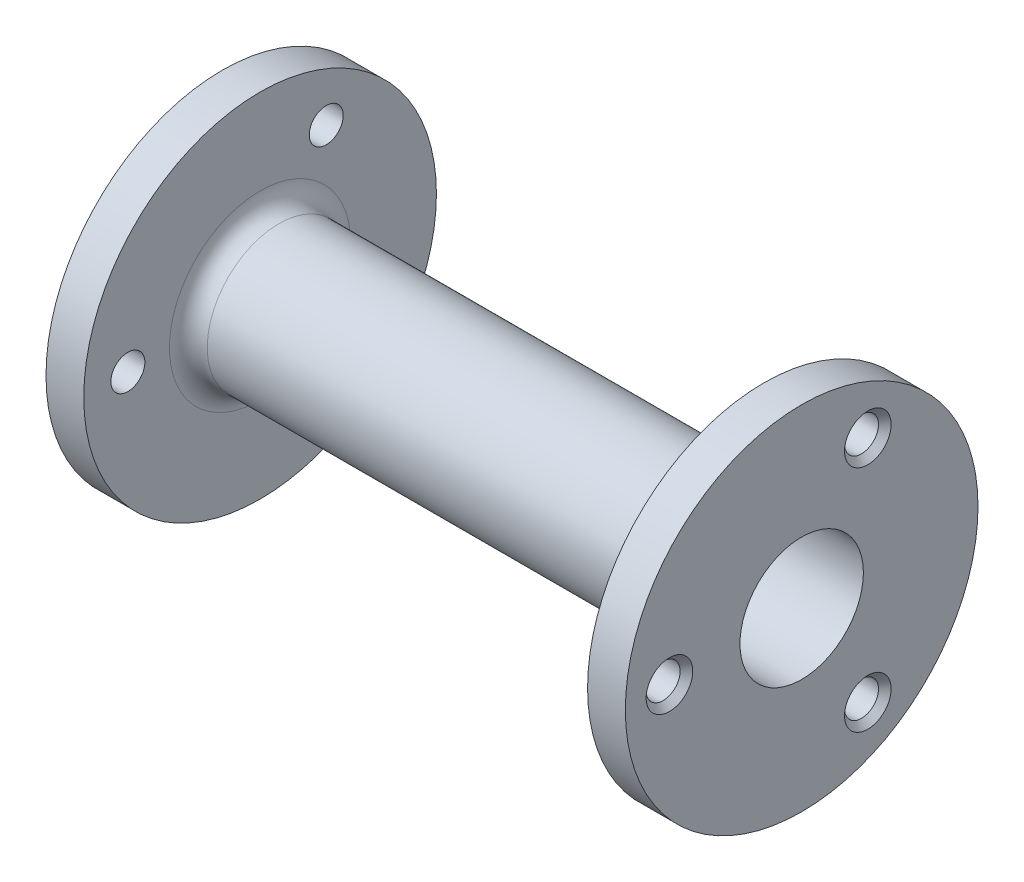
ISO-10303-21;
HEADER;
FILE_DESCRIPTION(('STEP AP214'),'2;1');
FILE_NAME('part.step','',(''),(''),'','','');
FILE_SCHEMA(('AUTOMOTIVE_DESIGN { 1 0 10303 214 1 1 1 1 }'));
ENDSEC;
DATA;
#1=APPLICATION_CONTEXT('core data for automotive mechanical design processes');
#2=APPLICATION_PROTOCOL_DEFINITION('international standard','automotive_design',2000,#1);
#3=PRODUCT_CONTEXT('',#1,'mechanical');
#4=PRODUCT('Part','Part','',(#3));
#5=PRODUCT_RELATED_PRODUCT_CATEGORY('part','',(#4));
#6=PRODUCT_DEFINITION_FORMATION('','',#4);
#7=PRODUCT_DEFINITION_CONTEXT('part definition',#1,'design');
#8=PRODUCT_DEFINITION('design','',#6,#7);
#9=PRODUCT_DEFINITION_SHAPE('','',#8);
#10=(LENGTH_UNIT() NAMED_UNIT(*) SI_UNIT(.MILLI.,.METRE.));
#11=(NAMED_UNIT(*) PLANE_ANGLE_UNIT() SI_UNIT($,.RADIAN.));
#12=(NAMED_UNIT(*) SI_UNIT($,.STERADIAN.) SOLID_ANGLE_UNIT());
#13=UNCERTAINTY_MEASURE_WITH_UNIT(LENGTH_MEASURE(1.E-05),#10,'distance_accuracy_value','');
#14=(GEOMETRIC_REPRESENTATION_CONTEXT(3) GLOBAL_UNCERTAINTY_ASSIGNED_CONTEXT((#13)) GLOBAL_UNIT_ASSIGNED_CONTEXT((#10,
#11,#12)) REPRESENTATION_CONTEXT('',''));
#15=CARTESIAN_POINT('',(0.,0.,0.));
#16=DIRECTION('',(0.,0.,1.));
#17=DIRECTION('',(1.,0.,0.));
#18=AXIS2_PLACEMENT_3D('',#15,#16,#17);
#19=CARTESIAN_POINT('',(0.,0.,0.));
#20=DIRECTION('',(1.,0.,0.));
#21=DIRECTION('',(0.,0.,-1.));
#22=AXIS2_PLACEMENT_3D('',#19,#20,#21);
#23=CYLINDRICAL_SURFACE('',#22,14.);
#24=CARTESIAN_POINT('',(0.,0.,0.));
#25=DIRECTION('',(1.,0.,0.));
#26=DIRECTION('',(0.,0.,-1.));
#27=AXIS2_PLACEMENT_3D('',#24,#25,#26);
#28=CIRCLE('',#27,14.);
#29=CARTESIAN_POINT('',(0.,0.,-14.));
#30=VERTEX_POINT('',#29);
#31=EDGE_CURVE('E104',#30,#30,#28,.T.);
#32=ORIENTED_EDGE('',*,*,#31,.T.);
#33=EDGE_LOOP('',(#32));
#34=FACE_BOUND('',#33,.T.);
#35=CARTESIAN_POINT('',(3.,0.,0.));
#36=DIRECTION('',(1.,0.,0.));
#37=DIRECTION('',(0.,0.,-1.));
#38=AXIS2_PLACEMENT_3D('',#35,#36,#37);
#39=CIRCLE('',#38,14.);
#40=CARTESIAN_POINT('',(3.,0.,-14.));
#41=VERTEX_POINT('',#40);
#42=EDGE_CURVE('E77',#41,#41,#39,.T.);
#43=ORIENTED_EDGE('',*,*,#42,.F.);
#44=EDGE_LOOP('',(#43));
#45=FACE_BOUND('',#44,.T.);
#46=ADVANCED_FACE('F33',(#34,#45),#23,.T.);
#47=CARTESIAN_POINT('',(3.,14.,0.));
#48=DIRECTION('',(1.,0.,0.));
#49=DIRECTION('',(0.,0.,-1.));
#50=AXIS2_PLACEMENT_3D('',#47,#48,#49);
#51=PLANE('',#50);
#52=CARTESIAN_POINT('',(3.,0.,10.5));
#53=DIRECTION('',(1.,0.,0.));
#54=DIRECTION('',(0.,0.,-1.));
#55=AXIS2_PLACEMENT_3D('',#52,#53,#54);
#56=CIRCLE('',#55,1.35);
#57=CARTESIAN_POINT('',(3.,0.,9.15));
#58=VERTEX_POINT('',#57);
#59=EDGE_CURVE('E107',#58,#58,#56,.T.);
#60=ORIENTED_EDGE('',*,*,#59,.F.);
#61=EDGE_LOOP('',(#60));
#62=FACE_BOUND('',#61,.T.);
#63=CARTESIAN_POINT('',(3.,9.09326673973658,-5.25000000000007));
#64=DIRECTION('',(1.,0.,0.));
#65=DIRECTION('',(0.,0.,-1.));
#66=AXIS2_PLACEMENT_3D('',#63,#64,#65);
#67=CIRCLE('',#66,1.35);
#68=CARTESIAN_POINT('',(3.,9.09326673973658,-6.60000000000007));
#69=VERTEX_POINT('',#68);
#70=EDGE_CURVE('E113',#69,#69,#67,.T.);
#71=ORIENTED_EDGE('',*,*,#70,.F.);
#72=EDGE_LOOP('',(#71));
#73=FACE_BOUND('',#72,.T.);
#74=CARTESIAN_POINT('',(3.,-9.09326673973668,-5.25000000000001));
#75=DIRECTION('',(1.,0.,0.));
#76=DIRECTION('',(0.,0.,-1.));
#77=AXIS2_PLACEMENT_3D('',#74,#75,#76);
#78=CIRCLE('',#77,1.35);
#79=CARTESIAN_POINT('',(3.,-9.09326673973668,-6.60000000000001));
#80=VERTEX_POINT('',#79);
#81=EDGE_CURVE('E119',#80,#80,#78,.T.);
#82=ORIENTED_EDGE('',*,*,#81,.F.);
#83=EDGE_LOOP('',(#82));
#84=FACE_BOUND('',#83,.T.);
#85=ORIENTED_EDGE('',*,*,#42,.T.);
#86=EDGE_LOOP('',(#85));
#87=FACE_BOUND('',#86,.T.);
#88=CARTESIAN_POINT('',(3.,0.,0.));
#89=DIRECTION('',(1.,0.,0.));
#90=DIRECTION('',(0.,0.,-1.));
#91=AXIS2_PLACEMENT_3D('',#88,#89,#90);
#92=CIRCLE('',#91,7.2);
#93=CARTESIAN_POINT('',(3.,0.,-7.2));
#94=VERTEX_POINT('',#93);
#95=EDGE_CURVE('E80',#94,#94,#92,.T.);
#96=ORIENTED_EDGE('',*,*,#95,.F.);
#97=EDGE_LOOP('',(#96));
#98=FACE_BOUND('',#97,.T.);
#99=ADVANCED_FACE('F167',(#62,#73,#84,#87,#98),#51,.T.);
#100=CARTESIAN_POINT('',(4.5,0.,0.));
#101=DIRECTION('',(1.,0.,0.));
#102=DIRECTION('',(0.,0.,-1.));
#103=AXIS2_PLACEMENT_3D('',#100,#101,#102);
#104=TOROIDAL_SURFACE('',#103,7.2,1.5);
#105=ORIENTED_EDGE('',*,*,#95,.T.);
#106=EDGE_LOOP('',(#105));
#107=FACE_BOUND('',#106,.T.);
#108=CARTESIAN_POINT('',(4.5,0.,0.));
#109=DIRECTION('',(1.,0.,0.));
#110=DIRECTION('',(0.,0.,-1.));
#111=AXIS2_PLACEMENT_3D('',#108,#109,#110);
#112=CIRCLE('',#111,5.7);
#113=CARTESIAN_POINT('',(4.5,0.,-5.7));
#114=VERTEX_POINT('',#113);
#115=EDGE_CURVE('E83',#114,#114,#112,.T.);
#116=ORIENTED_EDGE('',*,*,#115,.F.);
#117=EDGE_LOOP('',(#116));
#118=FACE_BOUND('',#117,.T.);
#119=ADVANCED_FACE('F173',(#107,#118),#104,.F.);
#120=CARTESIAN_POINT('',(0.,0.,0.));
#121=DIRECTION('',(1.,0.,0.));
#122=DIRECTION('',(0.,0.,-1.));
#123=AXIS2_PLACEMENT_3D('',#120,#121,#122);
#124=CYLINDRICAL_SURFACE('',#123,5.7);
#125=ORIENTED_EDGE('',*,*,#115,.T.);
#126=EDGE_LOOP('',(#125));
#127=FACE_BOUND('',#126,.T.);
#128=CARTESIAN_POINT('',(41.5,0.,0.));
#129=DIRECTION('',(1.,0.,0.));
#130=DIRECTION('',(0.,0.,-1.));
#131=AXIS2_PLACEMENT_3D('',#128,#129,#130);
#132=CIRCLE('',#131,5.7);
#133=CARTESIAN_POINT('',(41.5,0.,-5.7));
#134=VERTEX_POINT('',#133);
#135=EDGE_CURVE('E86',#134,#134,#132,.T.);
#136=ORIENTED_EDGE('',*,*,#135,.F.);
#137=EDGE_LOOP('',(#136));
#138=FACE_BOUND('',#137,.T.);
#139=ADVANCED_FACE('F180',(#127,#138),#124,.T.);
#140=CARTESIAN_POINT('',(41.5,0.,0.));
#141=DIRECTION('',(1.,0.,0.));
#142=DIRECTION('',(0.,0.,-1.));
#143=AXIS2_PLACEMENT_3D('',#140,#141,#142);
#144=TOROIDAL_SURFACE('',#143,7.2,1.5);
#145=ORIENTED_EDGE('',*,*,#135,.T.);
#146=EDGE_LOOP('',(#145));
#147=FACE_BOUND('',#146,.T.);
#148=CARTESIAN_POINT('',(43.,0.,0.));
#149=DIRECTION('',(1.,0.,0.));
#150=DIRECTION('',(0.,0.,-1.));
#151=AXIS2_PLACEMENT_3D('',#148,#149,#150);
#152=CIRCLE('',#151,7.2);
#153=CARTESIAN_POINT('',(43.,0.,-7.2));
#154=VERTEX_POINT('',#153);
#155=EDGE_CURVE('E89',#154,#154,#152,.T.);
#156=ORIENTED_EDGE('',*,*,#155,.F.);
#157=EDGE_LOOP('',(#156));
#158=FACE_BOUND('',#157,.T.);
#159=ADVANCED_FACE('F132',(#147,#158),#144,.F.);
#160=CARTESIAN_POINT('',(43.,7.2,0.));
#161=DIRECTION('',(-1.,0.,0.));
#162=DIRECTION('',(0.,0.,1.));
#163=AXIS2_PLACEMENT_3D('',#160,#161,#162);
#164=PLANE('',#163);
#165=CARTESIAN_POINT('',(43.,0.,10.5));
#166=DIRECTION('',(-1.,0.,0.));
#167=DIRECTION('',(0.,0.,1.));
#168=AXIS2_PLACEMENT_3D('',#165,#166,#167);
#169=CIRCLE('',#168,1.35);
#170=CARTESIAN_POINT('',(43.,0.,11.85));
#171=VERTEX_POINT('',#170);
#172=EDGE_CURVE('E110',#171,#171,#169,.T.);
#173=ORIENTED_EDGE('',*,*,#172,.F.);
#174=EDGE_LOOP('',(#173));
#175=FACE_BOUND('',#174,.T.);
#176=CARTESIAN_POINT('',(43.,9.09326673973658,-5.25000000000007));
#177=DIRECTION('',(-1.,0.,0.));
#178=DIRECTION('',(0.,0.,1.));
#179=AXIS2_PLACEMENT_3D('',#176,#177,#178);
#180=CIRCLE('',#179,1.35);
#181=CARTESIAN_POINT('',(43.,9.09326673973658,-3.90000000000007));
#182=VERTEX_POINT('',#181);
#183=EDGE_CURVE('E116',#182,#182,#180,.T.);
#184=ORIENTED_EDGE('',*,*,#183,.F.);
#185=EDGE_LOOP('',(#184));
#186=FACE_BOUND('',#185,.T.);
#187=CARTESIAN_POINT('',(43.,-9.09326673973668,-5.25000000000001));
#188=DIRECTION('',(-1.,0.,0.));
#189=DIRECTION('',(0.,0.,1.));
#190=AXIS2_PLACEMENT_3D('',#187,#188,#189);
#191=CIRCLE('',#190,1.35);
#192=CARTESIAN_POINT('',(43.,-9.09326673973668,-3.90000000000001));
#193=VERTEX_POINT('',#192);
#194=EDGE_CURVE('E122',#193,#193,#191,.T.);
#195=ORIENTED_EDGE('',*,*,#194,.F.);
#196=EDGE_LOOP('',(#195));
#197=FACE_BOUND('',#196,.T.);
#198=ORIENTED_EDGE('',*,*,#155,.T.);
#199=EDGE_LOOP('',(#198));
#200=FACE_BOUND('',#199,.T.);
#201=CARTESIAN_POINT('',(43.,0.,0.));
#202=DIRECTION('',(1.,0.,0.));
#203=DIRECTION('',(0.,0.,-1.));
#204=AXIS2_PLACEMENT_3D('',#201,#202,#203);
#205=CIRCLE('',#204,14.);
#206=CARTESIAN_POINT('',(43.,0.,-14.));
#207=VERTEX_POINT('',#206);
#208=EDGE_CURVE('E92',#207,#207,#205,.T.);
#209=ORIENTED_EDGE('',*,*,#208,.F.);
#210=EDGE_LOOP('',(#209));
#211=FACE_BOUND('',#210,.T.);
#212=ADVANCED_FACE('F128',(#175,#186,#197,#200,#211),#164,.T.);
#213=CARTESIAN_POINT('',(0.,0.,0.));
#214=DIRECTION('',(1.,0.,0.));
#215=DIRECTION('',(0.,0.,-1.));
#216=AXIS2_PLACEMENT_3D('',#213,#214,#215);
#217=CYLINDRICAL_SURFACE('',#216,14.);
#218=ORIENTED_EDGE('',*,*,#208,.T.);
#219=EDGE_LOOP('',(#218));
#220=FACE_BOUND('',#219,.T.);
#221=CARTESIAN_POINT('',(46.,0.,0.));
#222=DIRECTION('',(1.,0.,0.));
#223=DIRECTION('',(0.,0.,-1.));
#224=AXIS2_PLACEMENT_3D('',#221,#222,#223);
#225=CIRCLE('',#224,14.);
#226=CARTESIAN_POINT('',(46.,0.,-14.));
#227=VERTEX_POINT('',#226);
#228=EDGE_CURVE('E95',#227,#227,#225,.T.);
#229=ORIENTED_EDGE('',*,*,#228,.F.);
#230=EDGE_LOOP('',(#229));
#231=FACE_BOUND('',#230,.T.);
#232=ADVANCED_FACE('F131',(#220,#231),#217,.T.);
#233=CARTESIAN_POINT('',(46.,14.,0.));
#234=DIRECTION('',(1.,0.,0.));
#235=DIRECTION('',(0.,0.,-1.));
#236=AXIS2_PLACEMENT_3D('',#233,#234,#235);
#237=PLANE('',#236);
#238=CARTESIAN_POINT('',(46.,0.,10.5));
#239=DIRECTION('',(1.,0.,0.));
#240=DIRECTION('',(0.,0.,-1.));
#241=AXIS2_PLACEMENT_3D('',#238,#239,#240);
#242=CIRCLE('',#241,1.85);
#243=CARTESIAN_POINT('',(46.,0.,8.65));
#244=VERTEX_POINT('',#243);
#245=EDGE_CURVE('E44',#244,#244,#242,.F.);
#246=ORIENTED_EDGE('',*,*,#245,.T.);
#247=EDGE_LOOP('',(#246));
#248=FACE_BOUND('',#247,.T.);
#249=CARTESIAN_POINT('',(46.,-9.09326673973668,-5.25000000000001));
#250=DIRECTION('',(1.,0.,0.));
#251=DIRECTION('',(0.,0.,-1.));
#252=AXIS2_PLACEMENT_3D('',#249,#250,#251);
#253=CIRCLE('',#252,1.85);
#254=CARTESIAN_POINT('',(46.,-9.09326673973668,-7.10000000000002));
#255=VERTEX_POINT('',#254);
#256=EDGE_CURVE('E48',#255,#255,#253,.F.);
#257=ORIENTED_EDGE('',*,*,#256,.T.);
#258=EDGE_LOOP('',(#257));
#259=FACE_BOUND('',#258,.T.);
#260=CARTESIAN_POINT('',(46.,9.09326673973658,-5.25000000000007));
#261=DIRECTION('',(1.,0.,0.));
#262=DIRECTION('',(0.,0.,-1.));
#263=AXIS2_PLACEMENT_3D('',#260,#261,#262);
#264=CIRCLE('',#263,1.85);
#265=CARTESIAN_POINT('',(46.,9.09326673973658,-7.10000000000008));
#266=VERTEX_POINT('',#265);
#267=EDGE_CURVE('E53',#266,#266,#264,.F.);
#268=ORIENTED_EDGE('',*,*,#267,.T.);
#269=EDGE_LOOP('',(#268));
#270=FACE_BOUND('',#269,.T.);
#271=ORIENTED_EDGE('',*,*,#228,.T.);
#272=EDGE_LOOP('',(#271));
#273=FACE_BOUND('',#272,.T.);
#274=CARTESIAN_POINT('',(46.,0.,0.));
#275=DIRECTION('',(1.,0.,0.));
#276=DIRECTION('',(0.,0.,-1.));
#277=AXIS2_PLACEMENT_3D('',#274,#275,#276);
#278=CIRCLE('',#277,4.9);
#279=CARTESIAN_POINT('',(46.,0.,-4.9));
#280=VERTEX_POINT('',#279);
#281=EDGE_CURVE('E98',#280,#280,#278,.T.);
#282=ORIENTED_EDGE('',*,*,#281,.F.);
#283=EDGE_LOOP('',(#282));
#284=FACE_BOUND('',#283,.T.);
#285=ADVANCED_FACE('F141',(#248,#259,#270,#273,#284),#237,.T.);
#286=CARTESIAN_POINT('',(0.,0.,0.));
#287=DIRECTION('',(1.,0.,0.));
#288=DIRECTION('',(0.,0.,-1.));
#289=AXIS2_PLACEMENT_3D('',#286,#287,#288);
#290=CYLINDRICAL_SURFACE('',#289,4.9);
#291=ORIENTED_EDGE('',*,*,#281,.T.);
#292=EDGE_LOOP('',(#291));
#293=FACE_BOUND('',#292,.T.);
#294=CARTESIAN_POINT('',(0.,0.,0.));
#295=DIRECTION('',(1.,0.,0.));
#296=DIRECTION('',(0.,0.,-1.));
#297=AXIS2_PLACEMENT_3D('',#294,#295,#296);
#298=CIRCLE('',#297,4.9);
#299=CARTESIAN_POINT('',(0.,0.,-4.9));
#300=VERTEX_POINT('',#299);
#301=EDGE_CURVE('E101',#300,#300,#298,.T.);
#302=ORIENTED_EDGE('',*,*,#301,.F.);
#303=EDGE_LOOP('',(#302));
#304=FACE_BOUND('',#303,.T.);
#305=ADVANCED_FACE('F147',(#293,#304),#290,.F.);
#306=CARTESIAN_POINT('',(0.,4.9,0.));
#307=DIRECTION('',(-1.,0.,0.));
#308=DIRECTION('',(0.,0.,1.));
#309=AXIS2_PLACEMENT_3D('',#306,#307,#308);
#310=PLANE('',#309);
#311=CARTESIAN_POINT('',(0.,-9.09326673973668,-5.25000000000001));
#312=DIRECTION('',(-1.,0.,0.));
#313=DIRECTION('',(0.,0.,1.));
#314=AXIS2_PLACEMENT_3D('',#311,#312,#313);
#315=CIRCLE('',#314,1.84999999999998);
#316=CARTESIAN_POINT('',(0.,-9.09326673973668,-3.40000000000003));
#317=VERTEX_POINT('',#316);
#318=EDGE_CURVE('E68',#317,#317,#315,.F.);
#319=ORIENTED_EDGE('',*,*,#318,.T.);
#320=EDGE_LOOP('',(#319));
#321=FACE_BOUND('',#320,.T.);
#322=CARTESIAN_POINT('',(0.,9.09326673973658,-5.25000000000007));
#323=DIRECTION('',(-1.,0.,0.));
#324=DIRECTION('',(0.,0.,1.));
#325=AXIS2_PLACEMENT_3D('',#322,#323,#324);
#326=CIRCLE('',#325,1.85);
#327=CARTESIAN_POINT('',(0.,9.09326673973658,-3.40000000000007));
#328=VERTEX_POINT('',#327);
#329=EDGE_CURVE('E71',#328,#328,#326,.F.);
#330=ORIENTED_EDGE('',*,*,#329,.T.);
#331=EDGE_LOOP('',(#330));
#332=FACE_BOUND('',#331,.T.);
#333=CARTESIAN_POINT('',(0.,0.,10.5));
#334=DIRECTION('',(-1.,0.,0.));
#335=DIRECTION('',(0.,0.,1.));
#336=AXIS2_PLACEMENT_3D('',#333,#334,#335);
#337=CIRCLE('',#336,1.84999999999999);
#338=CARTESIAN_POINT('',(0.,0.,12.35));
#339=VERTEX_POINT('',#338);
#340=EDGE_CURVE('E74',#339,#339,#337,.F.);
#341=ORIENTED_EDGE('',*,*,#340,.T.);
#342=EDGE_LOOP('',(#341));
#343=FACE_BOUND('',#342,.T.);
#344=ORIENTED_EDGE('',*,*,#301,.T.);
#345=EDGE_LOOP('',(#344));
#346=FACE_BOUND('',#345,.T.);
#347=ORIENTED_EDGE('',*,*,#31,.F.);
#348=EDGE_LOOP('',(#347));
#349=FACE_BOUND('',#348,.T.);
#350=ADVANCED_FACE('F154',(#321,#332,#343,#346,#349),#310,.T.);
#351=CARTESIAN_POINT('',(0.,-9.09326673973668,-5.25000000000001));
#352=DIRECTION('',(1.,0.,0.));
#353=DIRECTION('',(0.,0.,-1.));
#354=AXIS2_PLACEMENT_3D('',#351,#352,#353);
#355=CYLINDRICAL_SURFACE('',#354,1.35);
#356=CARTESIAN_POINT('',(0.499999999999993,-9.09326673973668,-5.25000000000001));
#357=DIRECTION('',(-1.,0.,0.));
#358=DIRECTION('',(0.,0.,1.));
#359=AXIS2_PLACEMENT_3D('',#356,#357,#358);
#360=CIRCLE('',#359,1.35);
#361=CARTESIAN_POINT('',(0.499999999999993,-9.09326673973668,-3.90000000000001));
#362=VERTEX_POINT('',#361);
#363=EDGE_CURVE('E65',#362,#362,#360,.T.);
#364=ORIENTED_EDGE('',*,*,#363,.T.);
#365=EDGE_LOOP('',(#364));
#366=FACE_BOUND('',#365,.T.);
#367=ORIENTED_EDGE('',*,*,#81,.T.);
#368=EDGE_LOOP('',(#367));
#369=FACE_BOUND('',#368,.T.);
#370=ADVANCED_FACE('F160',(#366,#369),#355,.F.);
#371=CARTESIAN_POINT('',(0.,9.09326673973658,-5.25000000000007));
#372=DIRECTION('',(1.,0.,0.));
#373=DIRECTION('',(0.,0.,-1.));
#374=AXIS2_PLACEMENT_3D('',#371,#372,#373);
#375=CYLINDRICAL_SURFACE('',#374,1.35);
#376=CARTESIAN_POINT('',(0.5,9.09326673973658,-5.25000000000007));
#377=DIRECTION('',(-1.,0.,0.));
#378=DIRECTION('',(0.,0.,1.));
#379=AXIS2_PLACEMENT_3D('',#376,#377,#378);
#380=CIRCLE('',#379,1.35);
#381=CARTESIAN_POINT('',(0.5,9.09326673973658,-3.90000000000007));
#382=VERTEX_POINT('',#381);
#383=EDGE_CURVE('E62',#382,#382,#380,.T.);
#384=ORIENTED_EDGE('',*,*,#383,.T.);
#385=EDGE_LOOP('',(#384));
#386=FACE_BOUND('',#385,.T.);
#387=ORIENTED_EDGE('',*,*,#70,.T.);
#388=EDGE_LOOP('',(#387));
#389=FACE_BOUND('',#388,.T.);
#390=ADVANCED_FACE('F275',(#386,#389),#375,.F.);
#391=CARTESIAN_POINT('',(0.,0.,10.5));
#392=DIRECTION('',(1.,0.,0.));
#393=DIRECTION('',(0.,0.,-1.));
#394=AXIS2_PLACEMENT_3D('',#391,#392,#393);
#395=CYLINDRICAL_SURFACE('',#394,1.35);
#396=CARTESIAN_POINT('',(0.499999999999999,0.,10.5));
#397=DIRECTION('',(-1.,0.,0.));
#398=DIRECTION('',(0.,0.,1.));
#399=AXIS2_PLACEMENT_3D('',#396,#397,#398);
#400=CIRCLE('',#399,1.35);
#401=CARTESIAN_POINT('',(0.499999999999999,0.,11.85));
#402=VERTEX_POINT('',#401);
#403=EDGE_CURVE('E59',#402,#402,#400,.T.);
#404=ORIENTED_EDGE('',*,*,#403,.T.);
#405=EDGE_LOOP('',(#404));
#406=FACE_BOUND('',#405,.T.);
#407=ORIENTED_EDGE('',*,*,#59,.T.);
#408=EDGE_LOOP('',(#407));
#409=FACE_BOUND('',#408,.T.);
#410=ADVANCED_FACE('F266',(#406,#409),#395,.F.);
#411=CARTESIAN_POINT('',(45.5,-9.09326673973668,-5.25000000000001));
#412=DIRECTION('',(1.,0.,0.));
#413=DIRECTION('',(0.,0.,-1.));
#414=AXIS2_PLACEMENT_3D('',#411,#412,#413);
#415=CIRCLE('',#414,1.35);
#416=CARTESIAN_POINT('',(45.5,-9.09326673973668,-6.60000000000001));
#417=VERTEX_POINT('',#416);
#418=EDGE_CURVE('E40',#417,#417,#415,.T.);
#419=ORIENTED_EDGE('',*,*,#418,.T.);
#420=EDGE_LOOP('',(#419));
#421=FACE_BOUND('',#420,.T.);
#422=ORIENTED_EDGE('',*,*,#194,.T.);
#423=EDGE_LOOP('',(#422));
#424=FACE_BOUND('',#423,.T.);
#425=ADVANCED_FACE('F126',(#421,#424),#355,.F.);
#426=CARTESIAN_POINT('',(45.5,9.09326673973658,-5.25000000000007));
#427=DIRECTION('',(1.,0.,0.));
#428=DIRECTION('',(0.,0.,-1.));
#429=AXIS2_PLACEMENT_3D('',#426,#427,#428);
#430=CIRCLE('',#429,1.35);
#431=CARTESIAN_POINT('',(45.5,9.09326673973658,-6.60000000000007));
#432=VERTEX_POINT('',#431);
#433=EDGE_CURVE('E10',#432,#432,#430,.T.);
#434=ORIENTED_EDGE('',*,*,#433,.T.);
#435=EDGE_LOOP('',(#434));
#436=FACE_BOUND('',#435,.T.);
#437=ORIENTED_EDGE('',*,*,#183,.T.);
#438=EDGE_LOOP('',(#437));
#439=FACE_BOUND('',#438,.T.);
#440=ADVANCED_FACE('F263',(#436,#439),#375,.F.);
#441=CARTESIAN_POINT('',(45.5,0.,10.5));
#442=DIRECTION('',(1.,0.,0.));
#443=DIRECTION('',(0.,0.,-1.));
#444=AXIS2_PLACEMENT_3D('',#441,#442,#443);
#445=CIRCLE('',#444,1.35);
#446=CARTESIAN_POINT('',(45.5,0.,9.15));
#447=VERTEX_POINT('',#446);
#448=EDGE_CURVE('E56',#447,#447,#445,.T.);
#449=ORIENTED_EDGE('',*,*,#448,.T.);
#450=EDGE_LOOP('',(#449));
#451=FACE_BOUND('',#450,.T.);
#452=ORIENTED_EDGE('',*,*,#172,.T.);
#453=EDGE_LOOP('',(#452));
#454=FACE_BOUND('',#453,.T.);
#455=ADVANCED_FACE('F199',(#451,#454),#395,.F.);
#456=CARTESIAN_POINT('',(0.,-9.09326673973668,-5.25000000000001));
#457=DIRECTION('',(-1.,0.,0.));
#458=DIRECTION('',(0.,0.,1.));
#459=AXIS2_PLACEMENT_3D('',#456,#457,#458);
#460=CONICAL_SURFACE('',#459,1.84999999999998,0.785398163397439);
#461=ORIENTED_EDGE('',*,*,#363,.F.);
#462=EDGE_LOOP('',(#461));
#463=FACE_BOUND('',#462,.T.);
#464=ORIENTED_EDGE('',*,*,#318,.F.);
#465=EDGE_LOOP('',(#464));
#466=FACE_BOUND('',#465,.T.);
#467=ADVANCED_FACE('F195',(#463,#466),#460,.F.);
#468=CARTESIAN_POINT('',(0.,9.09326673973658,-5.25000000000007));
#469=DIRECTION('',(-1.,0.,0.));
#470=DIRECTION('',(0.,0.,1.));
#471=AXIS2_PLACEMENT_3D('',#468,#469,#470);
#472=CONICAL_SURFACE('',#471,1.85,0.785398163397446);
#473=ORIENTED_EDGE('',*,*,#383,.F.);
#474=EDGE_LOOP('',(#473));
#475=FACE_BOUND('',#474,.T.);
#476=ORIENTED_EDGE('',*,*,#329,.F.);
#477=EDGE_LOOP('',(#476));
#478=FACE_BOUND('',#477,.T.);
#479=ADVANCED_FACE('F198',(#475,#478),#472,.F.);
#480=CARTESIAN_POINT('',(0.,0.,10.5));
#481=DIRECTION('',(-1.,0.,0.));
#482=DIRECTION('',(0.,0.,1.));
#483=AXIS2_PLACEMENT_3D('',#480,#481,#482);
#484=CONICAL_SURFACE('',#483,1.84999999999999,0.785398163397439);
#485=ORIENTED_EDGE('',*,*,#403,.F.);
#486=EDGE_LOOP('',(#485));
#487=FACE_BOUND('',#486,.T.);
#488=ORIENTED_EDGE('',*,*,#340,.F.);
#489=EDGE_LOOP('',(#488));
#490=FACE_BOUND('',#489,.T.);
#491=ADVANCED_FACE('F203',(#487,#490),#484,.F.);
#492=CARTESIAN_POINT('',(45.5,0.,10.5));
#493=DIRECTION('',(1.,0.,0.));
#494=DIRECTION('',(0.,0.,-1.));
#495=AXIS2_PLACEMENT_3D('',#492,#493,#494);
#496=CONICAL_SURFACE('',#495,1.35,0.785398163397445);
#497=ORIENTED_EDGE('',*,*,#245,.F.);
#498=EDGE_LOOP('',(#497));
#499=FACE_BOUND('',#498,.T.);
#500=ORIENTED_EDGE('',*,*,#448,.F.);
#501=EDGE_LOOP('',(#500));
#502=FACE_BOUND('',#501,.T.);
#503=ADVANCED_FACE('F207',(#499,#502),#496,.F.);
#504=CARTESIAN_POINT('',(45.5,-9.09326673973668,-5.25000000000001));
#505=DIRECTION('',(1.,0.,0.));
#506=DIRECTION('',(0.,0.,-1.));
#507=AXIS2_PLACEMENT_3D('',#504,#505,#506);
#508=CONICAL_SURFACE('',#507,1.35,0.785398163397446);
#509=ORIENTED_EDGE('',*,*,#256,.F.);
#510=EDGE_LOOP('',(#509));
#511=FACE_BOUND('',#510,.T.);
#512=ORIENTED_EDGE('',*,*,#418,.F.);
#513=EDGE_LOOP('',(#512));
#514=FACE_BOUND('',#513,.T.);
#515=ADVANCED_FACE('F210',(#511,#514),#508,.F.);
#516=CARTESIAN_POINT('',(45.5,9.09326673973658,-5.25000000000007));
#517=DIRECTION('',(1.,0.,0.));
#518=DIRECTION('',(0.,0.,-1.));
#519=AXIS2_PLACEMENT_3D('',#516,#517,#518);
#520=CONICAL_SURFACE('',#519,1.35,0.785398163397446);
#521=ORIENTED_EDGE('',*,*,#267,.F.);
#522=EDGE_LOOP('',(#521));
#523=FACE_BOUND('',#522,.T.);
#524=ORIENTED_EDGE('',*,*,#433,.F.);
#525=EDGE_LOOP('',(#524));
#526=FACE_BOUND('',#525,.T.);
#527=ADVANCED_FACE('F35',(#523,#526),#520,.F.);
#528=CLOSED_SHELL('',(#46,#99,#119,#139,#159,#212,#232,#285,#305,#350,#370,#390,#410,#425,#440,
#455,#467,#479,#491,#503,#515,#527));
#529=MANIFOLD_SOLID_BREP('B2',#528);
#530=ADVANCED_BREP_SHAPE_REPRESENTATION('',(#18,#529),#14);
#531=SHAPE_DEFINITION_REPRESENTATION(#9,#530);
ENDSEC;
END-ISO-10303-21;
